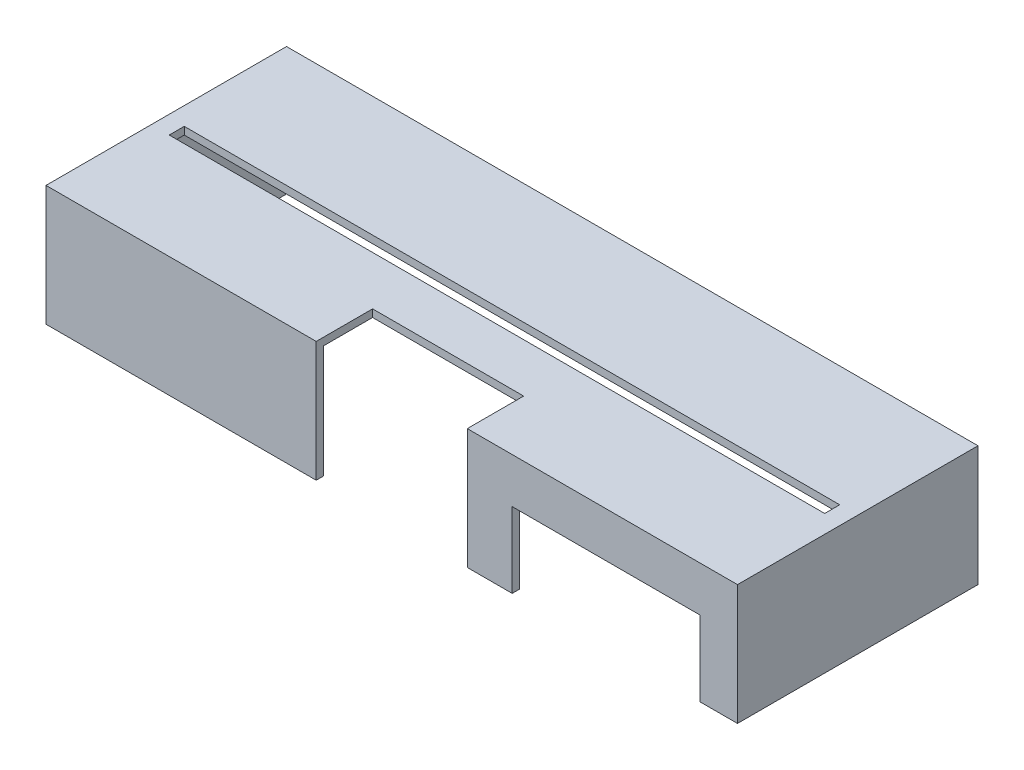
ISO-10303-21;
HEADER;
FILE_DESCRIPTION(('STEP AP214'),'2;1');
FILE_NAME('part.step','',(''),(''),'','','');
FILE_SCHEMA(('AUTOMOTIVE_DESIGN { 1 0 10303 214 1 1 1 1 }'));
ENDSEC;
DATA;
#1=APPLICATION_CONTEXT('core data for automotive mechanical design processes');
#2=APPLICATION_PROTOCOL_DEFINITION('international standard','automotive_design',2000,#1);
#3=PRODUCT_CONTEXT('',#1,'mechanical');
#4=PRODUCT('Part','Part','',(#3));
#5=PRODUCT_RELATED_PRODUCT_CATEGORY('part','',(#4));
#6=PRODUCT_DEFINITION_FORMATION('','',#4);
#7=PRODUCT_DEFINITION_CONTEXT('part definition',#1,'design');
#8=PRODUCT_DEFINITION('design','',#6,#7);
#9=PRODUCT_DEFINITION_SHAPE('','',#8);
#10=(LENGTH_UNIT() NAMED_UNIT(*) SI_UNIT(.MILLI.,.METRE.));
#11=(NAMED_UNIT(*) PLANE_ANGLE_UNIT() SI_UNIT($,.RADIAN.));
#12=(NAMED_UNIT(*) SI_UNIT($,.STERADIAN.) SOLID_ANGLE_UNIT());
#13=UNCERTAINTY_MEASURE_WITH_UNIT(LENGTH_MEASURE(1.E-05),#10,'distance_accuracy_value','');
#14=(GEOMETRIC_REPRESENTATION_CONTEXT(3) GLOBAL_UNCERTAINTY_ASSIGNED_CONTEXT((#13)) GLOBAL_UNIT_ASSIGNED_CONTEXT((#10,
#11,#12)) REPRESENTATION_CONTEXT('',''));
#15=CARTESIAN_POINT('',(0.,0.,0.));
#16=DIRECTION('',(0.,0.,1.));
#17=DIRECTION('',(1.,0.,0.));
#18=AXIS2_PLACEMENT_3D('',#15,#16,#17);
#19=CARTESIAN_POINT('',(0.,0.,0.));
#20=DIRECTION('',(0.,1.,0.));
#21=DIRECTION('',(0.,0.,1.));
#22=AXIS2_PLACEMENT_3D('',#19,#20,#21);
#23=PLANE('',#22);
#24=DIRECTION('',(1.,0.,0.));
#25=VECTOR('',#24,1.);
#26=CARTESIAN_POINT('',(-90.,0.,32.));
#27=LINE('',#26,#25);
#28=CARTESIAN_POINT('',(20.097892133789,0.,32.));
#29=VERTEX_POINT('',#28);
#30=CARTESIAN_POINT('',(32.0489460668945,0.,32.));
#31=VERTEX_POINT('',#30);
#32=EDGE_CURVE('E468',#29,#31,#27,.T.);
#33=ORIENTED_EDGE('',*,*,#32,.F.);
#34=DIRECTION('',(0.,0.,-1.));
#35=VECTOR('',#34,1.);
#36=CARTESIAN_POINT('',(20.097892133789,0.,0.));
#37=LINE('',#36,#35);
#38=CARTESIAN_POINT('',(20.097892133789,0.,30.));
#39=VERTEX_POINT('',#38);
#40=EDGE_CURVE('E134',#29,#39,#37,.T.);
#41=ORIENTED_EDGE('',*,*,#40,.T.);
#42=DIRECTION('',(1.,0.,0.));
#43=VECTOR('',#42,1.);
#44=CARTESIAN_POINT('',(-90.,0.,30.));
#45=LINE('',#44,#43);
#46=CARTESIAN_POINT('',(32.0489460668945,0.,30.));
#47=VERTEX_POINT('',#46);
#48=EDGE_CURVE('E440',#39,#47,#45,.T.);
#49=ORIENTED_EDGE('',*,*,#48,.T.);
#50=DIRECTION('',(0.,0.,1.));
#51=VECTOR('',#50,1.);
#52=CARTESIAN_POINT('',(32.0489460668945,0.,0.));
#53=LINE('',#52,#51);
#54=EDGE_CURVE('E485',#47,#31,#53,.T.);
#55=ORIENTED_EDGE('',*,*,#54,.T.);
#56=EDGE_LOOP('',(#33,#41,#49,#55));
#57=FACE_BOUND('',#56,.T.);
#58=ADVANCED_FACE('F110',(#57),#23,.F.);
#59=CARTESIAN_POINT('',(-90.,30.,32.));
#60=DIRECTION('',(0.,0.,-1.));
#61=DIRECTION('',(-1.,0.,0.));
#62=AXIS2_PLACEMENT_3D('',#59,#60,#61);
#63=PLANE('',#62);
#64=DIRECTION('',(-1.,0.,0.));
#65=VECTOR('',#64,1.);
#66=CARTESIAN_POINT('',(32.0489460668945,20.,32.));
#67=LINE('',#66,#65);
#68=CARTESIAN_POINT('',(82.0489460668945,20.,32.));
#69=VERTEX_POINT('',#68);
#70=CARTESIAN_POINT('',(32.0489460668945,20.,32.));
#71=VERTEX_POINT('',#70);
#72=EDGE_CURVE('E303',#69,#71,#67,.T.);
#73=ORIENTED_EDGE('',*,*,#72,.F.);
#74=DIRECTION('',(0.,1.,0.));
#75=VECTOR('',#74,1.);
#76=CARTESIAN_POINT('',(82.0489460668945,20.,32.));
#77=LINE('',#76,#75);
#78=CARTESIAN_POINT('',(82.0489460668945,0.,32.));
#79=VERTEX_POINT('',#78);
#80=EDGE_CURVE('E285',#79,#69,#77,.T.);
#81=ORIENTED_EDGE('',*,*,#80,.F.);
#82=CARTESIAN_POINT('',(92.,0.,32.));
#83=VERTEX_POINT('',#82);
#84=EDGE_CURVE('E464',#79,#83,#27,.T.);
#85=ORIENTED_EDGE('',*,*,#84,.T.);
#86=DIRECTION('',(0.,-1.,0.));
#87=VECTOR('',#86,1.);
#88=CARTESIAN_POINT('',(92.,30.,32.));
#89=LINE('',#88,#87);
#90=CARTESIAN_POINT('',(92.,32.,32.));
#91=VERTEX_POINT('',#90);
#92=EDGE_CURVE('E268',#91,#83,#89,.T.);
#93=ORIENTED_EDGE('',*,*,#92,.F.);
#94=DIRECTION('',(1.,0.,0.));
#95=VECTOR('',#94,1.);
#96=CARTESIAN_POINT('',(-92.,32.,32.));
#97=LINE('',#96,#95);
#98=CARTESIAN_POINT('',(20.097892133789,32.,32.));
#99=VERTEX_POINT('',#98);
#100=EDGE_CURVE('E260',#99,#91,#97,.T.);
#101=ORIENTED_EDGE('',*,*,#100,.F.);
#102=DIRECTION('',(0.,1.,0.));
#103=VECTOR('',#102,1.);
#104=CARTESIAN_POINT('',(20.097892133789,45.534799839415,32.));
#105=LINE('',#104,#103);
#106=EDGE_CURVE('E266',#29,#99,#105,.T.);
#107=ORIENTED_EDGE('',*,*,#106,.F.);
#108=ORIENTED_EDGE('',*,*,#32,.T.);
#109=DIRECTION('',(0.,-1.,0.));
#110=VECTOR('',#109,1.);
#111=CARTESIAN_POINT('',(32.0489460668945,20.,32.));
#112=LINE('',#111,#110);
#113=EDGE_CURVE('E126',#71,#31,#112,.T.);
#114=ORIENTED_EDGE('',*,*,#113,.F.);
#115=EDGE_LOOP('',(#73,#81,#85,#93,#101,#107,#108,#114));
#116=FACE_BOUND('',#115,.T.);
#117=ADVANCED_FACE('F263',(#116),#63,.F.);
#118=CARTESIAN_POINT('',(-90.,30.,30.));
#119=DIRECTION('',(0.,0.,-1.));
#120=DIRECTION('',(-1.,0.,0.));
#121=AXIS2_PLACEMENT_3D('',#118,#119,#120);
#122=PLANE('',#121);
#123=DIRECTION('',(0.,-1.,0.));
#124=VECTOR('',#123,1.);
#125=CARTESIAN_POINT('',(82.0489460668945,30.,30.));
#126=LINE('',#125,#124);
#127=CARTESIAN_POINT('',(82.0489460668945,20.,30.));
#128=VERTEX_POINT('',#127);
#129=CARTESIAN_POINT('',(82.0489460668945,0.,30.));
#130=VERTEX_POINT('',#129);
#131=EDGE_CURVE('E318',#128,#130,#126,.T.);
#132=ORIENTED_EDGE('',*,*,#131,.F.);
#133=DIRECTION('',(1.,0.,0.));
#134=VECTOR('',#133,1.);
#135=CARTESIAN_POINT('',(-90.,20.,30.));
#136=LINE('',#135,#134);
#137=CARTESIAN_POINT('',(32.0489460668945,20.,30.));
#138=VERTEX_POINT('',#137);
#139=EDGE_CURVE('E12',#138,#128,#136,.T.);
#140=ORIENTED_EDGE('',*,*,#139,.F.);
#141=DIRECTION('',(0.,1.,0.));
#142=VECTOR('',#141,1.);
#143=CARTESIAN_POINT('',(32.0489460668945,30.,30.));
#144=LINE('',#143,#142);
#145=EDGE_CURVE('E313',#47,#138,#144,.T.);
#146=ORIENTED_EDGE('',*,*,#145,.F.);
#147=ORIENTED_EDGE('',*,*,#48,.F.);
#148=DIRECTION('',(0.,-1.,0.));
#149=VECTOR('',#148,1.);
#150=CARTESIAN_POINT('',(20.097892133789,45.534799839415,30.));
#151=LINE('',#150,#149);
#152=CARTESIAN_POINT('',(20.097892133789,30.,30.));
#153=VERTEX_POINT('',#152);
#154=EDGE_CURVE('E332',#153,#39,#151,.T.);
#155=ORIENTED_EDGE('',*,*,#154,.F.);
#156=DIRECTION('',(1.,0.,0.));
#157=VECTOR('',#156,1.);
#158=CARTESIAN_POINT('',(-90.,30.,30.));
#159=LINE('',#158,#157);
#160=CARTESIAN_POINT('',(90.,30.,30.));
#161=VERTEX_POINT('',#160);
#162=EDGE_CURVE('E421',#153,#161,#159,.T.);
#163=ORIENTED_EDGE('',*,*,#162,.T.);
#164=DIRECTION('',(0.,-1.,0.));
#165=VECTOR('',#164,1.);
#166=CARTESIAN_POINT('',(90.,30.,30.));
#167=LINE('',#166,#165);
#168=CARTESIAN_POINT('',(90.,0.,30.));
#169=VERTEX_POINT('',#168);
#170=EDGE_CURVE('E425',#161,#169,#167,.T.);
#171=ORIENTED_EDGE('',*,*,#170,.T.);
#172=EDGE_CURVE('E437',#130,#169,#45,.T.);
#173=ORIENTED_EDGE('',*,*,#172,.F.);
#174=EDGE_LOOP('',(#132,#140,#146,#147,#155,#163,#171,#173));
#175=FACE_BOUND('',#174,.T.);
#176=ADVANCED_FACE('F499',(#175),#122,.T.);
#177=DIRECTION('',(0.,0.,1.));
#178=VECTOR('',#177,1.);
#179=CARTESIAN_POINT('',(-20.097892133789,0.,0.));
#180=LINE('',#179,#178);
#181=CARTESIAN_POINT('',(-20.097892133789,0.,30.));
#182=VERTEX_POINT('',#181);
#183=CARTESIAN_POINT('',(-20.097892133789,0.,32.));
#184=VERTEX_POINT('',#183);
#185=EDGE_CURVE('E346',#182,#184,#180,.T.);
#186=ORIENTED_EDGE('',*,*,#185,.T.);
#187=CARTESIAN_POINT('',(-92.,0.,32.));
#188=VERTEX_POINT('',#187);
#189=EDGE_CURVE('E465',#188,#184,#27,.T.);
#190=ORIENTED_EDGE('',*,*,#189,.F.);
#191=DIRECTION('',(0.,0.,1.));
#192=VECTOR('',#191,1.);
#193=CARTESIAN_POINT('',(-92.,0.,-30.));
#194=LINE('',#193,#192);
#195=CARTESIAN_POINT('',(-92.,0.,-32.));
#196=VERTEX_POINT('',#195);
#197=EDGE_CURVE('E461',#196,#188,#194,.T.);
#198=ORIENTED_EDGE('',*,*,#197,.F.);
#199=DIRECTION('',(-1.,0.,0.));
#200=VECTOR('',#199,1.);
#201=CARTESIAN_POINT('',(-90.,0.,-32.));
#202=LINE('',#201,#200);
#203=CARTESIAN_POINT('',(92.,0.,-32.));
#204=VERTEX_POINT('',#203);
#205=EDGE_CURVE('E458',#204,#196,#202,.T.);
#206=ORIENTED_EDGE('',*,*,#205,.F.);
#207=DIRECTION('',(0.,0.,-1.));
#208=VECTOR('',#207,1.);
#209=CARTESIAN_POINT('',(92.,0.,-30.));
#210=LINE('',#209,#208);
#211=EDGE_CURVE('E454',#83,#204,#210,.T.);
#212=ORIENTED_EDGE('',*,*,#211,.F.);
#213=ORIENTED_EDGE('',*,*,#84,.F.);
#214=DIRECTION('',(0.,0.,-1.));
#215=VECTOR('',#214,1.);
#216=CARTESIAN_POINT('',(82.0489460668945,0.,0.));
#217=LINE('',#216,#215);
#218=EDGE_CURVE('E119',#79,#130,#217,.T.);
#219=ORIENTED_EDGE('',*,*,#218,.T.);
#220=ORIENTED_EDGE('',*,*,#172,.T.);
#221=DIRECTION('',(0.,0.,-1.));
#222=VECTOR('',#221,1.);
#223=CARTESIAN_POINT('',(90.,0.,-30.));
#224=LINE('',#223,#222);
#225=CARTESIAN_POINT('',(90.,0.,-30.));
#226=VERTEX_POINT('',#225);
#227=EDGE_CURVE('E407',#169,#226,#224,.T.);
#228=ORIENTED_EDGE('',*,*,#227,.T.);
#229=DIRECTION('',(-1.,0.,0.));
#230=VECTOR('',#229,1.);
#231=CARTESIAN_POINT('',(-90.,0.,-30.));
#232=LINE('',#231,#230);
#233=CARTESIAN_POINT('',(-90.,0.,-30.));
#234=VERTEX_POINT('',#233);
#235=EDGE_CURVE('E429',#226,#234,#232,.T.);
#236=ORIENTED_EDGE('',*,*,#235,.T.);
#237=DIRECTION('',(0.,0.,1.));
#238=VECTOR('',#237,1.);
#239=CARTESIAN_POINT('',(-90.,0.,-30.));
#240=LINE('',#239,#238);
#241=CARTESIAN_POINT('',(-90.,0.,30.));
#242=VERTEX_POINT('',#241);
#243=EDGE_CURVE('E433',#234,#242,#240,.T.);
#244=ORIENTED_EDGE('',*,*,#243,.T.);
#245=EDGE_CURVE('E413',#242,#182,#45,.T.);
#246=ORIENTED_EDGE('',*,*,#245,.T.);
#247=EDGE_LOOP('',(#186,#190,#198,#206,#212,#213,#219,#220,#228,#236,#244,#246));
#248=FACE_BOUND('',#247,.T.);
#249=ADVANCED_FACE('F492',(#248),#23,.F.);
#250=CARTESIAN_POINT('',(92.,30.,-30.));
#251=DIRECTION('',(-1.,0.,0.));
#252=DIRECTION('',(0.,0.,1.));
#253=AXIS2_PLACEMENT_3D('',#250,#251,#252);
#254=PLANE('',#253);
#255=ORIENTED_EDGE('',*,*,#211,.T.);
#256=DIRECTION('',(0.,-1.,0.));
#257=VECTOR('',#256,1.);
#258=CARTESIAN_POINT('',(92.,30.,-32.));
#259=LINE('',#258,#257);
#260=CARTESIAN_POINT('',(92.,32.,-32.));
#261=VERTEX_POINT('',#260);
#262=EDGE_CURVE('E479',#261,#204,#259,.T.);
#263=ORIENTED_EDGE('',*,*,#262,.F.);
#264=DIRECTION('',(0.,0.,-1.));
#265=VECTOR('',#264,1.);
#266=CARTESIAN_POINT('',(92.,32.,-32.));
#267=LINE('',#266,#265);
#268=EDGE_CURVE('E400',#91,#261,#267,.T.);
#269=ORIENTED_EDGE('',*,*,#268,.F.);
#270=ORIENTED_EDGE('',*,*,#92,.T.);
#271=EDGE_LOOP('',(#255,#263,#269,#270));
#272=FACE_BOUND('',#271,.T.);
#273=ADVANCED_FACE('F112',(#272),#254,.F.);
#274=CARTESIAN_POINT('',(-90.,30.,-32.));
#275=DIRECTION('',(0.,0.,1.));
#276=DIRECTION('',(1.,0.,0.));
#277=AXIS2_PLACEMENT_3D('',#274,#275,#276);
#278=PLANE('',#277);
#279=ORIENTED_EDGE('',*,*,#205,.T.);
#280=DIRECTION('',(0.,-1.,0.));
#281=VECTOR('',#280,1.);
#282=CARTESIAN_POINT('',(-92.,30.,-32.));
#283=LINE('',#282,#281);
#284=CARTESIAN_POINT('',(-92.,32.,-32.));
#285=VERTEX_POINT('',#284);
#286=EDGE_CURVE('E475',#285,#196,#283,.T.);
#287=ORIENTED_EDGE('',*,*,#286,.F.);
#288=DIRECTION('',(-1.,0.,0.));
#289=VECTOR('',#288,1.);
#290=CARTESIAN_POINT('',(-92.,32.,-32.));
#291=LINE('',#290,#289);
#292=EDGE_CURVE('E403',#261,#285,#291,.T.);
#293=ORIENTED_EDGE('',*,*,#292,.F.);
#294=ORIENTED_EDGE('',*,*,#262,.T.);
#295=EDGE_LOOP('',(#279,#287,#293,#294));
#296=FACE_BOUND('',#295,.T.);
#297=ADVANCED_FACE('F543',(#296),#278,.F.);
#298=CARTESIAN_POINT('',(-92.,30.,-30.));
#299=DIRECTION('',(1.,0.,0.));
#300=DIRECTION('',(0.,0.,-1.));
#301=AXIS2_PLACEMENT_3D('',#298,#299,#300);
#302=PLANE('',#301);
#303=ORIENTED_EDGE('',*,*,#197,.T.);
#304=DIRECTION('',(0.,-1.,0.));
#305=VECTOR('',#304,1.);
#306=CARTESIAN_POINT('',(-92.,30.,32.));
#307=LINE('',#306,#305);
#308=CARTESIAN_POINT('',(-92.,32.,32.));
#309=VERTEX_POINT('',#308);
#310=EDGE_CURVE('E471',#309,#188,#307,.T.);
#311=ORIENTED_EDGE('',*,*,#310,.F.);
#312=DIRECTION('',(0.,0.,1.));
#313=VECTOR('',#312,1.);
#314=CARTESIAN_POINT('',(-92.,32.,-32.));
#315=LINE('',#314,#313);
#316=EDGE_CURVE('E273',#285,#309,#315,.T.);
#317=ORIENTED_EDGE('',*,*,#316,.F.);
#318=ORIENTED_EDGE('',*,*,#286,.T.);
#319=EDGE_LOOP('',(#303,#311,#317,#318));
#320=FACE_BOUND('',#319,.T.);
#321=ADVANCED_FACE('F539',(#320),#302,.F.);
#322=ORIENTED_EDGE('',*,*,#189,.T.);
#323=DIRECTION('',(0.,-1.,0.));
#324=VECTOR('',#323,1.);
#325=CARTESIAN_POINT('',(-20.097892133789,45.534799839415,32.));
#326=LINE('',#325,#324);
#327=CARTESIAN_POINT('',(-20.097892133789,32.,32.));
#328=VERTEX_POINT('',#327);
#329=EDGE_CURVE('E291',#328,#184,#326,.T.);
#330=ORIENTED_EDGE('',*,*,#329,.F.);
#331=EDGE_CURVE('E272',#309,#328,#97,.T.);
#332=ORIENTED_EDGE('',*,*,#331,.F.);
#333=ORIENTED_EDGE('',*,*,#310,.T.);
#334=EDGE_LOOP('',(#322,#330,#332,#333));
#335=FACE_BOUND('',#334,.T.);
#336=ADVANCED_FACE('F536',(#335),#63,.F.);
#337=CARTESIAN_POINT('',(90.,30.,-30.));
#338=DIRECTION('',(-1.,0.,0.));
#339=DIRECTION('',(0.,0.,1.));
#340=AXIS2_PLACEMENT_3D('',#337,#338,#339);
#341=PLANE('',#340);
#342=ORIENTED_EDGE('',*,*,#227,.F.);
#343=ORIENTED_EDGE('',*,*,#170,.F.);
#344=DIRECTION('',(0.,0.,-1.));
#345=VECTOR('',#344,1.);
#346=CARTESIAN_POINT('',(90.,30.,-30.));
#347=LINE('',#346,#345);
#348=CARTESIAN_POINT('',(90.,30.,-30.));
#349=VERTEX_POINT('',#348);
#350=EDGE_CURVE('E408',#161,#349,#347,.T.);
#351=ORIENTED_EDGE('',*,*,#350,.T.);
#352=DIRECTION('',(0.,-1.,0.));
#353=VECTOR('',#352,1.);
#354=CARTESIAN_POINT('',(90.,30.,-30.));
#355=LINE('',#354,#353);
#356=EDGE_CURVE('E450',#349,#226,#355,.T.);
#357=ORIENTED_EDGE('',*,*,#356,.T.);
#358=EDGE_LOOP('',(#342,#343,#351,#357));
#359=FACE_BOUND('',#358,.T.);
#360=ADVANCED_FACE('F531',(#359),#341,.T.);
#361=CARTESIAN_POINT('',(-90.,30.,-30.));
#362=DIRECTION('',(0.,0.,1.));
#363=DIRECTION('',(1.,0.,0.));
#364=AXIS2_PLACEMENT_3D('',#361,#362,#363);
#365=PLANE('',#364);
#366=ORIENTED_EDGE('',*,*,#235,.F.);
#367=ORIENTED_EDGE('',*,*,#356,.F.);
#368=DIRECTION('',(-1.,0.,0.));
#369=VECTOR('',#368,1.);
#370=CARTESIAN_POINT('',(-90.,30.,-30.));
#371=LINE('',#370,#369);
#372=CARTESIAN_POINT('',(-90.,30.,-30.));
#373=VERTEX_POINT('',#372);
#374=EDGE_CURVE('E412',#349,#373,#371,.T.);
#375=ORIENTED_EDGE('',*,*,#374,.T.);
#376=DIRECTION('',(0.,-1.,0.));
#377=VECTOR('',#376,1.);
#378=CARTESIAN_POINT('',(-90.,30.,-30.));
#379=LINE('',#378,#377);
#380=EDGE_CURVE('E447',#373,#234,#379,.T.);
#381=ORIENTED_EDGE('',*,*,#380,.T.);
#382=EDGE_LOOP('',(#366,#367,#375,#381));
#383=FACE_BOUND('',#382,.T.);
#384=ADVANCED_FACE('F528',(#383),#365,.T.);
#385=CARTESIAN_POINT('',(-90.,30.,-30.));
#386=DIRECTION('',(1.,0.,0.));
#387=DIRECTION('',(0.,0.,-1.));
#388=AXIS2_PLACEMENT_3D('',#385,#386,#387);
#389=PLANE('',#388);
#390=ORIENTED_EDGE('',*,*,#243,.F.);
#391=ORIENTED_EDGE('',*,*,#380,.F.);
#392=DIRECTION('',(0.,0.,1.));
#393=VECTOR('',#392,1.);
#394=CARTESIAN_POINT('',(-90.,30.,-30.));
#395=LINE('',#394,#393);
#396=CARTESIAN_POINT('',(-90.,30.,30.));
#397=VERTEX_POINT('',#396);
#398=EDGE_CURVE('E417',#373,#397,#395,.T.);
#399=ORIENTED_EDGE('',*,*,#398,.T.);
#400=DIRECTION('',(0.,-1.,0.));
#401=VECTOR('',#400,1.);
#402=CARTESIAN_POINT('',(-90.,30.,30.));
#403=LINE('',#402,#401);
#404=EDGE_CURVE('E444',#397,#242,#403,.T.);
#405=ORIENTED_EDGE('',*,*,#404,.T.);
#406=EDGE_LOOP('',(#390,#391,#399,#405));
#407=FACE_BOUND('',#406,.T.);
#408=ADVANCED_FACE('F526',(#407),#389,.T.);
#409=CARTESIAN_POINT('',(-20.097892133789,30.,30.));
#410=VERTEX_POINT('',#409);
#411=EDGE_CURVE('E422',#397,#410,#159,.T.);
#412=ORIENTED_EDGE('',*,*,#411,.T.);
#413=DIRECTION('',(0.,1.,0.));
#414=VECTOR('',#413,1.);
#415=CARTESIAN_POINT('',(-20.097892133789,45.534799839415,30.));
#416=LINE('',#415,#414);
#417=EDGE_CURVE('E328',#182,#410,#416,.T.);
#418=ORIENTED_EDGE('',*,*,#417,.F.);
#419=ORIENTED_EDGE('',*,*,#245,.F.);
#420=ORIENTED_EDGE('',*,*,#404,.F.);
#421=EDGE_LOOP('',(#412,#418,#419,#420));
#422=FACE_BOUND('',#421,.T.);
#423=ADVANCED_FACE('F522',(#422),#122,.T.);
#424=CARTESIAN_POINT('',(0.,30.,0.));
#425=DIRECTION('',(0.,1.,0.));
#426=DIRECTION('',(0.,0.,1.));
#427=AXIS2_PLACEMENT_3D('',#424,#425,#426);
#428=PLANE('',#427);
#429=ORIENTED_EDGE('',*,*,#162,.F.);
#430=DIRECTION('',(0.,0.,1.));
#431=VECTOR('',#430,1.);
#432=CARTESIAN_POINT('',(20.097892133789,30.,17.));
#433=LINE('',#432,#431);
#434=CARTESIAN_POINT('',(20.097892133789,30.,17.));
#435=VERTEX_POINT('',#434);
#436=EDGE_CURVE('E324',#435,#153,#433,.T.);
#437=ORIENTED_EDGE('',*,*,#436,.F.);
#438=DIRECTION('',(1.,0.,0.));
#439=VECTOR('',#438,1.);
#440=CARTESIAN_POINT('',(0.,30.,17.));
#441=LINE('',#440,#439);
#442=CARTESIAN_POINT('',(-20.097892133789,30.,17.));
#443=VERTEX_POINT('',#442);
#444=EDGE_CURVE('E342',#443,#435,#441,.T.);
#445=ORIENTED_EDGE('',*,*,#444,.F.);
#446=DIRECTION('',(0.,0.,-1.));
#447=VECTOR('',#446,1.);
#448=CARTESIAN_POINT('',(-20.097892133789,30.,17.));
#449=LINE('',#448,#447);
#450=EDGE_CURVE('E321',#410,#443,#449,.T.);
#451=ORIENTED_EDGE('',*,*,#450,.F.);
#452=ORIENTED_EDGE('',*,*,#411,.F.);
#453=ORIENTED_EDGE('',*,*,#398,.F.);
#454=ORIENTED_EDGE('',*,*,#374,.F.);
#455=ORIENTED_EDGE('',*,*,#350,.F.);
#456=EDGE_LOOP('',(#429,#437,#445,#451,#452,#453,#454,#455));
#457=FACE_BOUND('',#456,.T.);
#458=DIRECTION('',(1.,0.,0.));
#459=VECTOR('',#458,1.);
#460=CARTESIAN_POINT('',(0.,30.,4.));
#461=LINE('',#460,#459);
#462=CARTESIAN_POINT('',(-87.2097467494444,30.,4.));
#463=VERTEX_POINT('',#462);
#464=CARTESIAN_POINT('',(87.2097467494444,30.,4.));
#465=VERTEX_POINT('',#464);
#466=EDGE_CURVE('E388',#463,#465,#461,.T.);
#467=ORIENTED_EDGE('',*,*,#466,.T.);
#468=DIRECTION('',(0.,0.,-1.));
#469=VECTOR('',#468,1.);
#470=CARTESIAN_POINT('',(87.2097467494444,30.,0.));
#471=LINE('',#470,#469);
#472=CARTESIAN_POINT('',(87.2097467494444,30.,0.));
#473=VERTEX_POINT('',#472);
#474=EDGE_CURVE('E392',#465,#473,#471,.T.);
#475=ORIENTED_EDGE('',*,*,#474,.T.);
#476=DIRECTION('',(-1.,0.,0.));
#477=VECTOR('',#476,1.);
#478=CARTESIAN_POINT('',(0.,30.,0.));
#479=LINE('',#478,#477);
#480=CARTESIAN_POINT('',(-87.2097467494444,30.,0.));
#481=VERTEX_POINT('',#480);
#482=EDGE_CURVE('E371',#473,#481,#479,.T.);
#483=ORIENTED_EDGE('',*,*,#482,.T.);
#484=DIRECTION('',(0.,0.,1.));
#485=VECTOR('',#484,1.);
#486=CARTESIAN_POINT('',(-87.2097467494444,30.,0.));
#487=LINE('',#486,#485);
#488=EDGE_CURVE('E384',#481,#463,#487,.T.);
#489=ORIENTED_EDGE('',*,*,#488,.T.);
#490=EDGE_LOOP('',(#467,#475,#483,#489));
#491=FACE_BOUND('',#490,.T.);
#492=ADVANCED_FACE('F508',(#457,#491),#428,.F.);
#493=CARTESIAN_POINT('',(0.,32.,0.));
#494=DIRECTION('',(0.,1.,0.));
#495=DIRECTION('',(0.,0.,1.));
#496=AXIS2_PLACEMENT_3D('',#493,#494,#495);
#497=PLANE('',#496);
#498=ORIENTED_EDGE('',*,*,#331,.T.);
#499=DIRECTION('',(0.,0.,1.));
#500=VECTOR('',#499,1.);
#501=CARTESIAN_POINT('',(-20.097892133789,32.,17.));
#502=LINE('',#501,#500);
#503=CARTESIAN_POINT('',(-20.097892133789,32.,17.));
#504=VERTEX_POINT('',#503);
#505=EDGE_CURVE('E286',#504,#328,#502,.T.);
#506=ORIENTED_EDGE('',*,*,#505,.F.);
#507=DIRECTION('',(1.,0.,0.));
#508=VECTOR('',#507,1.);
#509=CARTESIAN_POINT('',(0.,32.,17.));
#510=LINE('',#509,#508);
#511=CARTESIAN_POINT('',(20.097892133789,32.,17.));
#512=VERTEX_POINT('',#511);
#513=EDGE_CURVE('E280',#504,#512,#510,.T.);
#514=ORIENTED_EDGE('',*,*,#513,.T.);
#515=DIRECTION('',(0.,0.,-1.));
#516=VECTOR('',#515,1.);
#517=CARTESIAN_POINT('',(20.097892133789,32.,17.));
#518=LINE('',#517,#516);
#519=EDGE_CURVE('E276',#99,#512,#518,.T.);
#520=ORIENTED_EDGE('',*,*,#519,.F.);
#521=ORIENTED_EDGE('',*,*,#100,.T.);
#522=ORIENTED_EDGE('',*,*,#268,.T.);
#523=ORIENTED_EDGE('',*,*,#292,.T.);
#524=ORIENTED_EDGE('',*,*,#316,.T.);
#525=EDGE_LOOP('',(#498,#506,#514,#520,#521,#522,#523,#524));
#526=FACE_BOUND('',#525,.T.);
#527=DIRECTION('',(0.,0.,-1.));
#528=VECTOR('',#527,1.);
#529=CARTESIAN_POINT('',(87.2097467494444,32.,0.));
#530=LINE('',#529,#528);
#531=CARTESIAN_POINT('',(87.2097467494444,32.,4.));
#532=VERTEX_POINT('',#531);
#533=CARTESIAN_POINT('',(87.2097467494444,32.,0.));
#534=VERTEX_POINT('',#533);
#535=EDGE_CURVE('E352',#532,#534,#530,.T.);
#536=ORIENTED_EDGE('',*,*,#535,.F.);
#537=DIRECTION('',(1.,0.,0.));
#538=VECTOR('',#537,1.);
#539=CARTESIAN_POINT('',(-87.2097467494444,32.,4.));
#540=LINE('',#539,#538);
#541=CARTESIAN_POINT('',(-87.2097467494444,32.,4.));
#542=VERTEX_POINT('',#541);
#543=EDGE_CURVE('E363',#542,#532,#540,.T.);
#544=ORIENTED_EDGE('',*,*,#543,.F.);
#545=DIRECTION('',(0.,0.,1.));
#546=VECTOR('',#545,1.);
#547=CARTESIAN_POINT('',(-87.2097467494444,32.,0.));
#548=LINE('',#547,#546);
#549=CARTESIAN_POINT('',(-87.2097467494444,32.,0.));
#550=VERTEX_POINT('',#549);
#551=EDGE_CURVE('E359',#550,#542,#548,.T.);
#552=ORIENTED_EDGE('',*,*,#551,.F.);
#553=DIRECTION('',(-1.,0.,0.));
#554=VECTOR('',#553,1.);
#555=CARTESIAN_POINT('',(-87.2097467494444,32.,0.));
#556=LINE('',#555,#554);
#557=EDGE_CURVE('E355',#534,#550,#556,.T.);
#558=ORIENTED_EDGE('',*,*,#557,.F.);
#559=EDGE_LOOP('',(#536,#544,#552,#558));
#560=FACE_BOUND('',#559,.T.);
#561=ADVANCED_FACE('F277',(#526,#560),#497,.T.);
#562=CARTESIAN_POINT('',(87.2097467494444,27.,0.));
#563=DIRECTION('',(1.,0.,0.));
#564=DIRECTION('',(0.,0.,-1.));
#565=AXIS2_PLACEMENT_3D('',#562,#563,#564);
#566=PLANE('',#565);
#567=DIRECTION('',(0.,1.,0.));
#568=VECTOR('',#567,1.);
#569=CARTESIAN_POINT('',(87.2097467494444,27.,4.));
#570=LINE('',#569,#568);
#571=EDGE_CURVE('E368',#465,#532,#570,.T.);
#572=ORIENTED_EDGE('',*,*,#571,.T.);
#573=ORIENTED_EDGE('',*,*,#535,.T.);
#574=DIRECTION('',(0.,1.,0.));
#575=VECTOR('',#574,1.);
#576=CARTESIAN_POINT('',(87.2097467494444,27.,0.));
#577=LINE('',#576,#575);
#578=EDGE_CURVE('E367',#473,#534,#577,.T.);
#579=ORIENTED_EDGE('',*,*,#578,.F.);
#580=ORIENTED_EDGE('',*,*,#474,.F.);
#581=EDGE_LOOP('',(#572,#573,#579,#580));
#582=FACE_BOUND('',#581,.T.);
#583=ADVANCED_FACE('F603',(#582),#566,.F.);
#584=CARTESIAN_POINT('',(-87.2097467494444,27.,4.));
#585=DIRECTION('',(0.,0.,1.));
#586=DIRECTION('',(1.,0.,0.));
#587=AXIS2_PLACEMENT_3D('',#584,#585,#586);
#588=PLANE('',#587);
#589=DIRECTION('',(0.,1.,0.));
#590=VECTOR('',#589,1.);
#591=CARTESIAN_POINT('',(-87.2097467494444,27.,4.));
#592=LINE('',#591,#590);
#593=EDGE_CURVE('E372',#463,#542,#592,.T.);
#594=ORIENTED_EDGE('',*,*,#593,.T.);
#595=ORIENTED_EDGE('',*,*,#543,.T.);
#596=ORIENTED_EDGE('',*,*,#571,.F.);
#597=ORIENTED_EDGE('',*,*,#466,.F.);
#598=EDGE_LOOP('',(#594,#595,#596,#597));
#599=FACE_BOUND('',#598,.T.);
#600=ADVANCED_FACE('F606',(#599),#588,.F.);
#601=CARTESIAN_POINT('',(-87.2097467494444,27.,0.));
#602=DIRECTION('',(-1.,0.,0.));
#603=DIRECTION('',(0.,0.,1.));
#604=AXIS2_PLACEMENT_3D('',#601,#602,#603);
#605=PLANE('',#604);
#606=DIRECTION('',(0.,1.,0.));
#607=VECTOR('',#606,1.);
#608=CARTESIAN_POINT('',(-87.2097467494444,27.,0.));
#609=LINE('',#608,#607);
#610=EDGE_CURVE('E375',#481,#550,#609,.T.);
#611=ORIENTED_EDGE('',*,*,#610,.T.);
#612=ORIENTED_EDGE('',*,*,#551,.T.);
#613=ORIENTED_EDGE('',*,*,#593,.F.);
#614=ORIENTED_EDGE('',*,*,#488,.F.);
#615=EDGE_LOOP('',(#611,#612,#613,#614));
#616=FACE_BOUND('',#615,.T.);
#617=ADVANCED_FACE('F614',(#616),#605,.F.);
#618=CARTESIAN_POINT('',(-87.2097467494444,27.,0.));
#619=DIRECTION('',(0.,0.,-1.));
#620=DIRECTION('',(-1.,0.,0.));
#621=AXIS2_PLACEMENT_3D('',#618,#619,#620);
#622=PLANE('',#621);
#623=ORIENTED_EDGE('',*,*,#578,.T.);
#624=ORIENTED_EDGE('',*,*,#557,.T.);
#625=ORIENTED_EDGE('',*,*,#610,.F.);
#626=ORIENTED_EDGE('',*,*,#482,.F.);
#627=EDGE_LOOP('',(#623,#624,#625,#626));
#628=FACE_BOUND('',#627,.T.);
#629=ADVANCED_FACE('F622',(#628),#622,.F.);
#630=CARTESIAN_POINT('',(20.097892133789,45.534799839415,17.));
#631=DIRECTION('',(1.,0.,0.));
#632=DIRECTION('',(0.,0.,-1.));
#633=AXIS2_PLACEMENT_3D('',#630,#631,#632);
#634=PLANE('',#633);
#635=ORIENTED_EDGE('',*,*,#40,.F.);
#636=ORIENTED_EDGE('',*,*,#106,.T.);
#637=ORIENTED_EDGE('',*,*,#519,.T.);
#638=DIRECTION('',(0.,1.,0.));
#639=VECTOR('',#638,1.);
#640=CARTESIAN_POINT('',(20.097892133789,45.534799839415,17.));
#641=LINE('',#640,#639);
#642=EDGE_CURVE('E335',#435,#512,#641,.T.);
#643=ORIENTED_EDGE('',*,*,#642,.F.);
#644=ORIENTED_EDGE('',*,*,#436,.T.);
#645=ORIENTED_EDGE('',*,*,#154,.T.);
#646=EDGE_LOOP('',(#635,#636,#637,#643,#644,#645));
#647=FACE_BOUND('',#646,.T.);
#648=ADVANCED_FACE('F288',(#647),#634,.F.);
#649=CARTESIAN_POINT('',(-20.097892133789,45.534799839415,17.));
#650=DIRECTION('',(-1.,0.,0.));
#651=DIRECTION('',(0.,0.,1.));
#652=AXIS2_PLACEMENT_3D('',#649,#650,#651);
#653=PLANE('',#652);
#654=ORIENTED_EDGE('',*,*,#505,.T.);
#655=ORIENTED_EDGE('',*,*,#329,.T.);
#656=ORIENTED_EDGE('',*,*,#185,.F.);
#657=ORIENTED_EDGE('',*,*,#417,.T.);
#658=ORIENTED_EDGE('',*,*,#450,.T.);
#659=DIRECTION('',(0.,-1.,0.));
#660=VECTOR('',#659,1.);
#661=CARTESIAN_POINT('',(-20.097892133789,45.534799839415,17.));
#662=LINE('',#661,#660);
#663=EDGE_CURVE('E338',#504,#443,#662,.T.);
#664=ORIENTED_EDGE('',*,*,#663,.F.);
#665=EDGE_LOOP('',(#654,#655,#656,#657,#658,#664));
#666=FACE_BOUND('',#665,.T.);
#667=ADVANCED_FACE('F516',(#666),#653,.F.);
#668=CARTESIAN_POINT('',(0.,0.,17.));
#669=DIRECTION('',(0.,0.,1.));
#670=DIRECTION('',(1.,0.,0.));
#671=AXIS2_PLACEMENT_3D('',#668,#669,#670);
#672=PLANE('',#671);
#673=ORIENTED_EDGE('',*,*,#444,.T.);
#674=ORIENTED_EDGE('',*,*,#642,.T.);
#675=ORIENTED_EDGE('',*,*,#513,.F.);
#676=ORIENTED_EDGE('',*,*,#663,.T.);
#677=EDGE_LOOP('',(#673,#674,#675,#676));
#678=FACE_BOUND('',#677,.T.);
#679=ADVANCED_FACE('F513',(#678),#672,.T.);
#680=CARTESIAN_POINT('',(82.0489460668945,20.,22.));
#681=DIRECTION('',(1.,0.,0.));
#682=DIRECTION('',(0.,0.,-1.));
#683=AXIS2_PLACEMENT_3D('',#680,#681,#682);
#684=PLANE('',#683);
#685=ORIENTED_EDGE('',*,*,#131,.T.);
#686=ORIENTED_EDGE('',*,*,#218,.F.);
#687=ORIENTED_EDGE('',*,*,#80,.T.);
#688=DIRECTION('',(0.,0.,1.));
#689=VECTOR('',#688,1.);
#690=CARTESIAN_POINT('',(82.0489460668945,20.,22.));
#691=LINE('',#690,#689);
#692=EDGE_CURVE('E309',#128,#69,#691,.T.);
#693=ORIENTED_EDGE('',*,*,#692,.F.);
#694=EDGE_LOOP('',(#685,#686,#687,#693));
#695=FACE_BOUND('',#694,.T.);
#696=ADVANCED_FACE('F657',(#695),#684,.F.);
#697=CARTESIAN_POINT('',(32.0489460668945,20.,22.));
#698=DIRECTION('',(-1.,0.,0.));
#699=DIRECTION('',(0.,-1.,0.));
#700=AXIS2_PLACEMENT_3D('',#697,#698,#699);
#701=PLANE('',#700);
#702=ORIENTED_EDGE('',*,*,#145,.T.);
#703=DIRECTION('',(0.,0.,1.));
#704=VECTOR('',#703,1.);
#705=CARTESIAN_POINT('',(32.0489460668945,20.,22.));
#706=LINE('',#705,#704);
#707=EDGE_CURVE('E310',#138,#71,#706,.T.);
#708=ORIENTED_EDGE('',*,*,#707,.T.);
#709=ORIENTED_EDGE('',*,*,#113,.T.);
#710=ORIENTED_EDGE('',*,*,#54,.F.);
#711=EDGE_LOOP('',(#702,#708,#709,#710));
#712=FACE_BOUND('',#711,.T.);
#713=ADVANCED_FACE('F665',(#712),#701,.F.);
#714=CARTESIAN_POINT('',(32.0489460668945,20.,22.));
#715=DIRECTION('',(0.,1.,0.));
#716=DIRECTION('',(0.,0.,1.));
#717=AXIS2_PLACEMENT_3D('',#714,#715,#716);
#718=PLANE('',#717);
#719=ORIENTED_EDGE('',*,*,#139,.T.);
#720=ORIENTED_EDGE('',*,*,#692,.T.);
#721=ORIENTED_EDGE('',*,*,#72,.T.);
#722=ORIENTED_EDGE('',*,*,#707,.F.);
#723=EDGE_LOOP('',(#719,#720,#721,#722));
#724=FACE_BOUND('',#723,.T.);
#725=ADVANCED_FACE('F672',(#724),#718,.F.);
#726=CLOSED_SHELL('',(#58,#117,#176,#249,#273,#297,#321,#336,#360,#384,#408,#423,#492,#561,#583,
#600,#617,#629,#648,#667,#679,#696,#713,#725));
#727=MANIFOLD_SOLID_BREP('B2',#726);
#728=ADVANCED_BREP_SHAPE_REPRESENTATION('',(#18,#727),#14);
#729=SHAPE_DEFINITION_REPRESENTATION(#9,#728);
ENDSEC;
END-ISO-10303-21;
